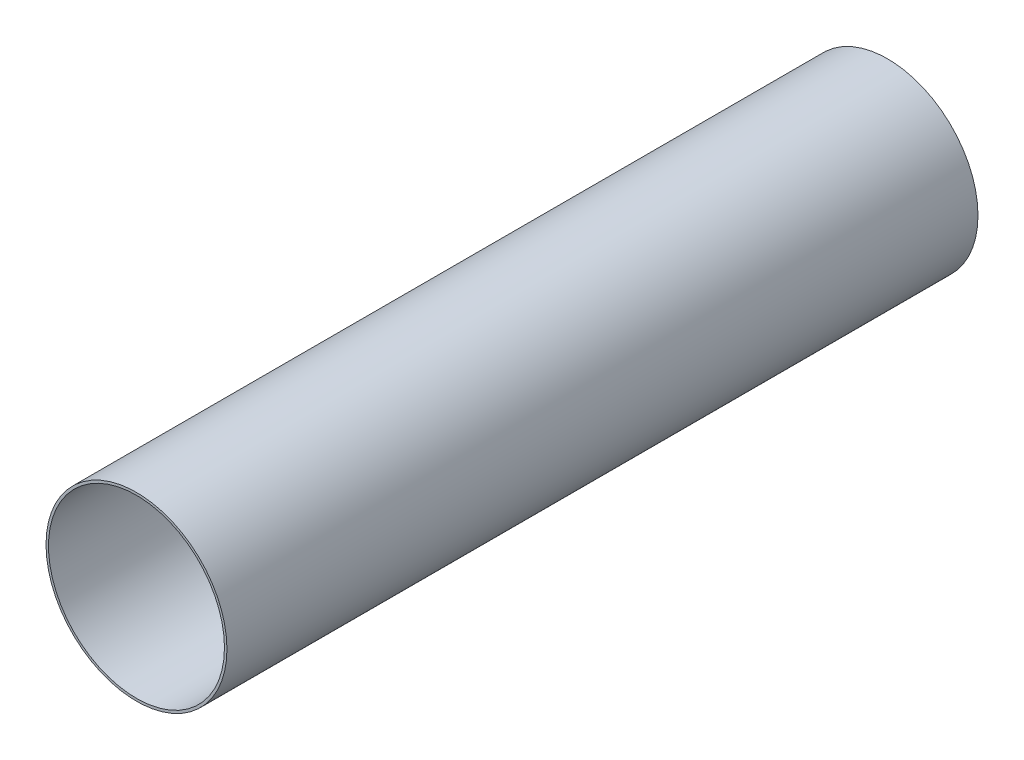
ISO-10303-21;
HEADER;
FILE_DESCRIPTION(('STEP AP214'),'2;1');
FILE_NAME('part.step','',(''),(''),'','','');
FILE_SCHEMA(('AUTOMOTIVE_DESIGN { 1 0 10303 214 1 1 1 1 }'));
ENDSEC;
DATA;
#1=APPLICATION_CONTEXT('core data for automotive mechanical design processes');
#2=APPLICATION_PROTOCOL_DEFINITION('international standard','automotive_design',2000,#1);
#3=PRODUCT_CONTEXT('',#1,'mechanical');
#4=PRODUCT('Part','Part','',(#3));
#5=PRODUCT_RELATED_PRODUCT_CATEGORY('part','',(#4));
#6=PRODUCT_DEFINITION_FORMATION('','',#4);
#7=PRODUCT_DEFINITION_CONTEXT('part definition',#1,'design');
#8=PRODUCT_DEFINITION('design','',#6,#7);
#9=PRODUCT_DEFINITION_SHAPE('','',#8);
#10=(LENGTH_UNIT() NAMED_UNIT(*) SI_UNIT(.MILLI.,.METRE.));
#11=(NAMED_UNIT(*) PLANE_ANGLE_UNIT() SI_UNIT($,.RADIAN.));
#12=(NAMED_UNIT(*) SI_UNIT($,.STERADIAN.) SOLID_ANGLE_UNIT());
#13=UNCERTAINTY_MEASURE_WITH_UNIT(LENGTH_MEASURE(1.E-05),#10,'distance_accuracy_value','');
#14=(GEOMETRIC_REPRESENTATION_CONTEXT(3) GLOBAL_UNCERTAINTY_ASSIGNED_CONTEXT((#13)) GLOBAL_UNIT_ASSIGNED_CONTEXT((#10,
#11,#12)) REPRESENTATION_CONTEXT('',''));
#15=CARTESIAN_POINT('',(0.,0.,0.));
#16=DIRECTION('',(0.,0.,1.));
#17=DIRECTION('',(1.,0.,0.));
#18=AXIS2_PLACEMENT_3D('',#15,#16,#17);
#19=CARTESIAN_POINT('',(0.,0.,604.));
#20=DIRECTION('',(0.,0.,1.));
#21=DIRECTION('',(1.,0.,0.));
#22=AXIS2_PLACEMENT_3D('',#19,#20,#21);
#23=PLANE('',#22);
#24=CARTESIAN_POINT('',(0.,0.,604.));
#25=DIRECTION('',(0.,0.,1.));
#26=DIRECTION('',(1.,0.,0.));
#27=AXIS2_PLACEMENT_3D('',#24,#25,#26);
#28=CIRCLE('',#27,73.);
#29=CARTESIAN_POINT('',(73.,0.,604.));
#30=VERTEX_POINT('',#29);
#31=EDGE_CURVE('E10',#30,#30,#28,.T.);
#32=ORIENTED_EDGE('',*,*,#31,.T.);
#33=EDGE_LOOP('',(#32));
#34=FACE_BOUND('',#33,.T.);
#35=CARTESIAN_POINT('',(0.,0.,604.));
#36=DIRECTION('',(0.,0.,1.));
#37=DIRECTION('',(1.,0.,0.));
#38=AXIS2_PLACEMENT_3D('',#35,#36,#37);
#39=CIRCLE('',#38,71.);
#40=CARTESIAN_POINT('',(71.,0.,604.));
#41=VERTEX_POINT('',#40);
#42=EDGE_CURVE('E40',#41,#41,#39,.T.);
#43=ORIENTED_EDGE('',*,*,#42,.F.);
#44=EDGE_LOOP('',(#43));
#45=FACE_BOUND('',#44,.T.);
#46=ADVANCED_FACE('F33',(#34,#45),#23,.T.);
#47=CARTESIAN_POINT('',(0.,0.,604.));
#48=DIRECTION('',(0.,0.,-1.));
#49=DIRECTION('',(-1.,0.,0.));
#50=AXIS2_PLACEMENT_3D('',#47,#48,#49);
#51=CYLINDRICAL_SURFACE('',#50,73.);
#52=ORIENTED_EDGE('',*,*,#31,.F.);
#53=EDGE_LOOP('',(#52));
#54=FACE_BOUND('',#53,.T.);
#55=CARTESIAN_POINT('',(0.,0.,-2.));
#56=DIRECTION('',(0.,0.,-1.));
#57=DIRECTION('',(-1.,0.,0.));
#58=AXIS2_PLACEMENT_3D('',#55,#56,#57);
#59=CIRCLE('',#58,73.);
#60=CARTESIAN_POINT('',(-73.,0.,-2.));
#61=VERTEX_POINT('',#60);
#62=EDGE_CURVE('E49',#61,#61,#59,.T.);
#63=ORIENTED_EDGE('',*,*,#62,.F.);
#64=EDGE_LOOP('',(#63));
#65=FACE_BOUND('',#64,.T.);
#66=ADVANCED_FACE('F35',(#54,#65),#51,.T.);
#67=CARTESIAN_POINT('',(0.,0.,604.));
#68=DIRECTION('',(0.,0.,-1.));
#69=DIRECTION('',(-1.,0.,0.));
#70=AXIS2_PLACEMENT_3D('',#67,#68,#69);
#71=CYLINDRICAL_SURFACE('',#70,71.);
#72=ORIENTED_EDGE('',*,*,#42,.T.);
#73=EDGE_LOOP('',(#72));
#74=FACE_BOUND('',#73,.T.);
#75=CARTESIAN_POINT('',(0.,0.,0.));
#76=DIRECTION('',(0.,0.,1.));
#77=DIRECTION('',(1.,0.,0.));
#78=AXIS2_PLACEMENT_3D('',#75,#76,#77);
#79=CIRCLE('',#78,71.);
#80=CARTESIAN_POINT('',(71.,0.,0.));
#81=VERTEX_POINT('',#80);
#82=EDGE_CURVE('E44',#81,#81,#79,.T.);
#83=ORIENTED_EDGE('',*,*,#82,.F.);
#84=EDGE_LOOP('',(#83));
#85=FACE_BOUND('',#84,.T.);
#86=ADVANCED_FACE('F57',(#74,#85),#71,.F.);
#87=CARTESIAN_POINT('',(0.,0.,0.));
#88=DIRECTION('',(0.,0.,-1.));
#89=DIRECTION('',(-1.,0.,0.));
#90=AXIS2_PLACEMENT_3D('',#87,#88,#89);
#91=PLANE('',#90);
#92=ORIENTED_EDGE('',*,*,#82,.T.);
#93=EDGE_LOOP('',(#92));
#94=FACE_BOUND('',#93,.T.);
#95=ADVANCED_FACE('F63',(#94),#91,.F.);
#96=CARTESIAN_POINT('',(0.,0.,-2.));
#97=DIRECTION('',(0.,0.,-1.));
#98=DIRECTION('',(-1.,0.,0.));
#99=AXIS2_PLACEMENT_3D('',#96,#97,#98);
#100=PLANE('',#99);
#101=ORIENTED_EDGE('',*,*,#62,.T.);
#102=EDGE_LOOP('',(#101));
#103=FACE_BOUND('',#102,.T.);
#104=ADVANCED_FACE('F54',(#103),#100,.T.);
#105=CLOSED_SHELL('',(#46,#66,#86,#95,#104));
#106=MANIFOLD_SOLID_BREP('B2',#105);
#107=ADVANCED_BREP_SHAPE_REPRESENTATION('',(#18,#106),#14);
#108=SHAPE_DEFINITION_REPRESENTATION(#9,#107);
ENDSEC;
END-ISO-10303-21;
